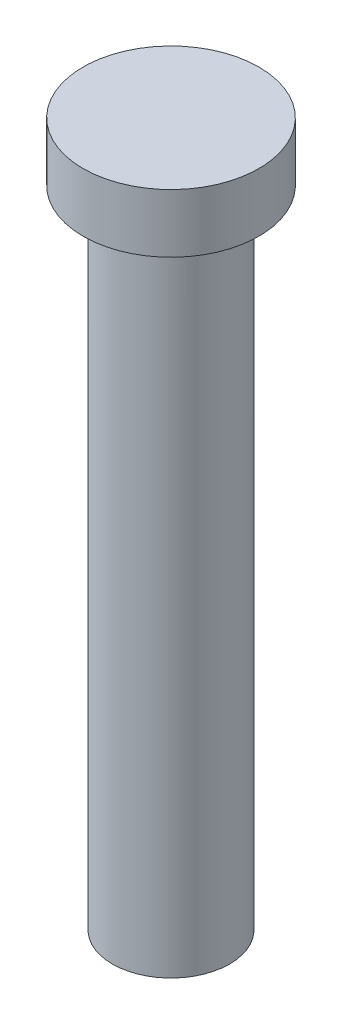
ISO-10303-21;
HEADER;
FILE_DESCRIPTION(('STEP AP214'),'2;1');
FILE_NAME('part.step','',(''),(''),'','','');
FILE_SCHEMA(('AUTOMOTIVE_DESIGN { 1 0 10303 214 1 1 1 1 }'));
ENDSEC;
DATA;
#1=APPLICATION_CONTEXT('core data for automotive mechanical design processes');
#2=APPLICATION_PROTOCOL_DEFINITION('international standard','automotive_design',2000,#1);
#3=PRODUCT_CONTEXT('',#1,'mechanical');
#4=PRODUCT('Part','Part','',(#3));
#5=PRODUCT_RELATED_PRODUCT_CATEGORY('part','',(#4));
#6=PRODUCT_DEFINITION_FORMATION('','',#4);
#7=PRODUCT_DEFINITION_CONTEXT('part definition',#1,'design');
#8=PRODUCT_DEFINITION('design','',#6,#7);
#9=PRODUCT_DEFINITION_SHAPE('','',#8);
#10=(LENGTH_UNIT() NAMED_UNIT(*) SI_UNIT(.MILLI.,.METRE.));
#11=(NAMED_UNIT(*) PLANE_ANGLE_UNIT() SI_UNIT($,.RADIAN.));
#12=(NAMED_UNIT(*) SI_UNIT($,.STERADIAN.) SOLID_ANGLE_UNIT());
#13=UNCERTAINTY_MEASURE_WITH_UNIT(LENGTH_MEASURE(1.E-05),#10,'distance_accuracy_value','');
#14=(GEOMETRIC_REPRESENTATION_CONTEXT(3) GLOBAL_UNCERTAINTY_ASSIGNED_CONTEXT((#13)) GLOBAL_UNIT_ASSIGNED_CONTEXT((#10,
#11,#12)) REPRESENTATION_CONTEXT('',''));
#15=CARTESIAN_POINT('',(0.,0.,0.));
#16=DIRECTION('',(0.,0.,1.));
#17=DIRECTION('',(1.,0.,0.));
#18=AXIS2_PLACEMENT_3D('',#15,#16,#17);
#19=CARTESIAN_POINT('',(0.,0.,0.));
#20=DIRECTION('',(0.,1.,0.));
#21=DIRECTION('',(0.,0.,1.));
#22=AXIS2_PLACEMENT_3D('',#19,#20,#21);
#23=PLANE('',#22);
#24=CARTESIAN_POINT('',(0.,0.,0.));
#25=DIRECTION('',(0.,1.,0.));
#26=DIRECTION('',(0.,0.,1.));
#27=AXIS2_PLACEMENT_3D('',#24,#25,#26);
#28=CIRCLE('',#27,4.7625);
#29=CARTESIAN_POINT('',(0.,0.,4.7625));
#30=VERTEX_POINT('',#29);
#31=EDGE_CURVE('E40',#30,#30,#28,.T.);
#32=ORIENTED_EDGE('',*,*,#31,.F.);
#33=EDGE_LOOP('',(#32));
#34=FACE_BOUND('',#33,.T.);
#35=CARTESIAN_POINT('',(0.,0.,0.));
#36=DIRECTION('',(0.,1.,0.));
#37=DIRECTION('',(0.,0.,1.));
#38=AXIS2_PLACEMENT_3D('',#35,#36,#37);
#39=CIRCLE('',#38,3.175);
#40=CARTESIAN_POINT('',(0.,0.,3.175));
#41=VERTEX_POINT('',#40);
#42=EDGE_CURVE('E10',#41,#41,#39,.F.);
#43=ORIENTED_EDGE('',*,*,#42,.F.);
#44=EDGE_LOOP('',(#43));
#45=FACE_BOUND('',#44,.T.);
#46=ADVANCED_FACE('F29',(#34,#45),#23,.F.);
#47=CARTESIAN_POINT('',(0.,3.175,0.));
#48=DIRECTION('',(0.,-1.,0.));
#49=DIRECTION('',(0.,0.,-1.));
#50=AXIS2_PLACEMENT_3D('',#47,#48,#49);
#51=CYLINDRICAL_SURFACE('',#50,4.7625);
#52=CARTESIAN_POINT('',(0.,3.175,0.));
#53=DIRECTION('',(0.,1.,0.));
#54=DIRECTION('',(0.,0.,1.));
#55=AXIS2_PLACEMENT_3D('',#52,#53,#54);
#56=CIRCLE('',#55,4.7625);
#57=CARTESIAN_POINT('',(0.,3.175,4.7625));
#58=VERTEX_POINT('',#57);
#59=EDGE_CURVE('E36',#58,#58,#56,.T.);
#60=ORIENTED_EDGE('',*,*,#59,.F.);
#61=EDGE_LOOP('',(#60));
#62=FACE_BOUND('',#61,.T.);
#63=ORIENTED_EDGE('',*,*,#31,.T.);
#64=EDGE_LOOP('',(#63));
#65=FACE_BOUND('',#64,.T.);
#66=ADVANCED_FACE('F31',(#62,#65),#51,.T.);
#67=CARTESIAN_POINT('',(0.,3.175,0.));
#68=DIRECTION('',(0.,1.,0.));
#69=DIRECTION('',(0.,0.,1.));
#70=AXIS2_PLACEMENT_3D('',#67,#68,#69);
#71=PLANE('',#70);
#72=ORIENTED_EDGE('',*,*,#59,.T.);
#73=EDGE_LOOP('',(#72));
#74=FACE_BOUND('',#73,.T.);
#75=ADVANCED_FACE('F54',(#74),#71,.T.);
#76=CARTESIAN_POINT('',(0.,-34.925,0.));
#77=DIRECTION('',(0.,1.,0.));
#78=DIRECTION('',(0.,0.,1.));
#79=AXIS2_PLACEMENT_3D('',#76,#77,#78);
#80=CYLINDRICAL_SURFACE('',#79,3.175);
#81=CARTESIAN_POINT('',(0.,-34.925,0.));
#82=DIRECTION('',(0.,-1.,0.));
#83=DIRECTION('',(0.,0.,-1.));
#84=AXIS2_PLACEMENT_3D('',#81,#82,#83);
#85=CIRCLE('',#84,3.175);
#86=CARTESIAN_POINT('',(0.,-34.925,-3.175));
#87=VERTEX_POINT('',#86);
#88=EDGE_CURVE('E45',#87,#87,#85,.T.);
#89=ORIENTED_EDGE('',*,*,#88,.F.);
#90=EDGE_LOOP('',(#89));
#91=FACE_BOUND('',#90,.T.);
#92=ORIENTED_EDGE('',*,*,#42,.T.);
#93=EDGE_LOOP('',(#92));
#94=FACE_BOUND('',#93,.T.);
#95=ADVANCED_FACE('F52',(#91,#94),#80,.T.);
#96=CARTESIAN_POINT('',(0.,-34.925,0.));
#97=DIRECTION('',(0.,-1.,0.));
#98=DIRECTION('',(0.,0.,-1.));
#99=AXIS2_PLACEMENT_3D('',#96,#97,#98);
#100=PLANE('',#99);
#101=ORIENTED_EDGE('',*,*,#88,.T.);
#102=EDGE_LOOP('',(#101));
#103=FACE_BOUND('',#102,.T.);
#104=ADVANCED_FACE('F50',(#103),#100,.T.);
#105=CLOSED_SHELL('',(#46,#66,#75,#95,#104));
#106=MANIFOLD_SOLID_BREP('B2',#105);
#107=ADVANCED_BREP_SHAPE_REPRESENTATION('',(#18,#106),#14);
#108=SHAPE_DEFINITION_REPRESENTATION(#9,#107);
ENDSEC;
END-ISO-10303-21;
